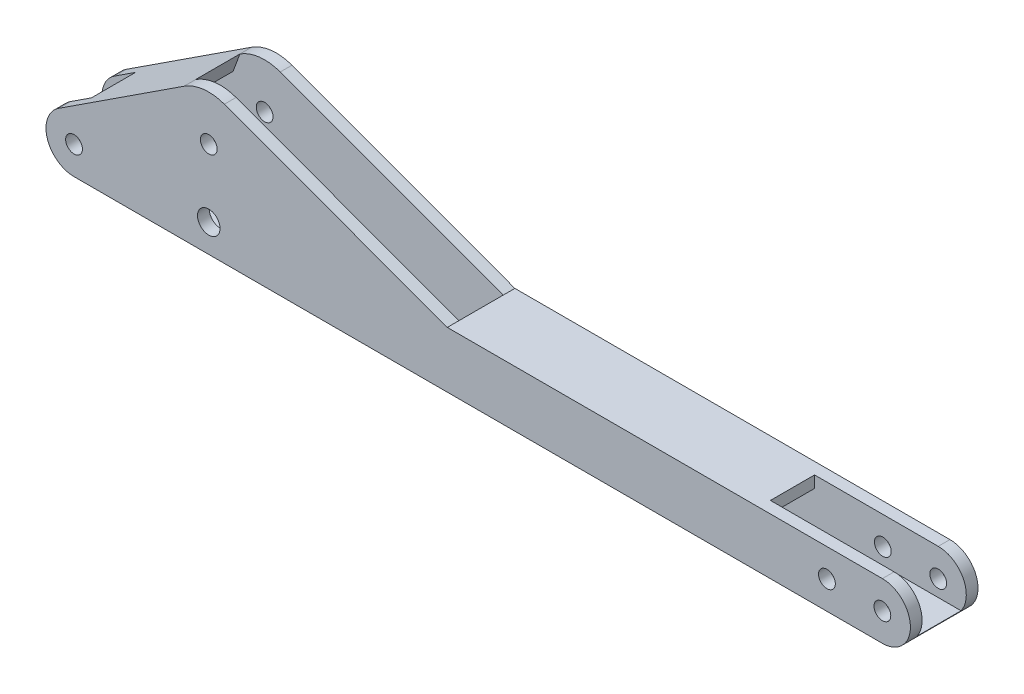
ISO-10303-21;
HEADER;
FILE_DESCRIPTION(('STEP AP214'),'2;1');
FILE_NAME('part.step','',(''),(''),'','','');
FILE_SCHEMA(('AUTOMOTIVE_DESIGN { 1 0 10303 214 1 1 1 1 }'));
ENDSEC;
DATA;
#1=APPLICATION_CONTEXT('core data for automotive mechanical design processes');
#2=APPLICATION_PROTOCOL_DEFINITION('international standard','automotive_design',2000,#1);
#3=PRODUCT_CONTEXT('',#1,'mechanical');
#4=PRODUCT('Part','Part','',(#3));
#5=PRODUCT_RELATED_PRODUCT_CATEGORY('part','',(#4));
#6=PRODUCT_DEFINITION_FORMATION('','',#4);
#7=PRODUCT_DEFINITION_CONTEXT('part definition',#1,'design');
#8=PRODUCT_DEFINITION('design','',#6,#7);
#9=PRODUCT_DEFINITION_SHAPE('','',#8);
#10=(LENGTH_UNIT() NAMED_UNIT(*) SI_UNIT(.MILLI.,.METRE.));
#11=(NAMED_UNIT(*) PLANE_ANGLE_UNIT() SI_UNIT($,.RADIAN.));
#12=(NAMED_UNIT(*) SI_UNIT($,.STERADIAN.) SOLID_ANGLE_UNIT());
#13=UNCERTAINTY_MEASURE_WITH_UNIT(LENGTH_MEASURE(1.E-05),#10,'distance_accuracy_value','');
#14=(GEOMETRIC_REPRESENTATION_CONTEXT(3) GLOBAL_UNCERTAINTY_ASSIGNED_CONTEXT((#13)) GLOBAL_UNIT_ASSIGNED_CONTEXT((#10,
#11,#12)) REPRESENTATION_CONTEXT('',''));
#15=CARTESIAN_POINT('',(0.,0.,0.));
#16=DIRECTION('',(0.,0.,1.));
#17=DIRECTION('',(1.,0.,0.));
#18=AXIS2_PLACEMENT_3D('',#15,#16,#17);
#19=CARTESIAN_POINT('',(20.4248576088717,127.,-306.));
#20=DIRECTION('',(0.,0.,1.));
#21=DIRECTION('',(1.,0.,0.));
#22=AXIS2_PLACEMENT_3D('',#19,#20,#21);
#23=CYLINDRICAL_SURFACE('',#22,127.);
#24=DIRECTION('',(0.,0.,1.));
#25=VECTOR('',#24,1.);
#26=CARTESIAN_POINT('',(20.4248576088717,0.,-306.));
#27=LINE('',#26,#25);
#28=CARTESIAN_POINT('',(20.4248576088717,0.,-306.));
#29=VERTEX_POINT('',#28);
#30=CARTESIAN_POINT('',(20.4248576088717,0.,-253.));
#31=VERTEX_POINT('',#30);
#32=EDGE_CURVE('E482',#29,#31,#27,.T.);
#33=ORIENTED_EDGE('',*,*,#32,.T.);
#34=CARTESIAN_POINT('',(20.4248576088717,127.,-253.));
#35=DIRECTION('',(0.,0.,-1.));
#36=DIRECTION('',(-1.,0.,0.));
#37=AXIS2_PLACEMENT_3D('',#34,#35,#36);
#38=CIRCLE('',#37,127.);
#39=CARTESIAN_POINT('',(-48.990064980917,233.351156654987,-253.));
#40=VERTEX_POINT('',#39);
#41=EDGE_CURVE('E269',#40,#31,#38,.F.);
#42=ORIENTED_EDGE('',*,*,#41,.F.);
#43=DIRECTION('',(0.,0.,1.));
#44=VECTOR('',#43,1.);
#45=CARTESIAN_POINT('',(-48.990064980917,233.351156654987,-306.));
#46=LINE('',#45,#44);
#47=CARTESIAN_POINT('',(-48.990064980917,233.351156654987,-306.));
#48=VERTEX_POINT('',#47);
#49=EDGE_CURVE('E454',#48,#40,#46,.T.);
#50=ORIENTED_EDGE('',*,*,#49,.F.);
#51=CARTESIAN_POINT('',(20.4248576088717,127.,-306.));
#52=DIRECTION('',(0.,0.,1.));
#53=DIRECTION('',(-1.,0.,0.));
#54=AXIS2_PLACEMENT_3D('',#51,#52,#53);
#55=CIRCLE('',#54,127.);
#56=EDGE_CURVE('E398',#48,#29,#55,.T.);
#57=ORIENTED_EDGE('',*,*,#56,.T.);
#58=EDGE_LOOP('',(#33,#42,#50,#57));
#59=FACE_BOUND('',#58,.T.);
#60=ADVANCED_FACE('F49',(#59),#23,.T.);
#61=CARTESIAN_POINT('',(20.4248576088717,0.,-306.));
#62=DIRECTION('',(0.,-1.,0.));
#63=DIRECTION('',(0.,0.,-1.));
#64=AXIS2_PLACEMENT_3D('',#61,#62,#63);
#65=PLANE('',#64);
#66=DIRECTION('',(0.,0.,1.));
#67=VECTOR('',#66,1.);
#68=CARTESIAN_POINT('',(238.666952125337,0.,-253.));
#69=LINE('',#68,#67);
#70=CARTESIAN_POINT('',(238.666952125337,0.,-253.));
#71=VERTEX_POINT('',#70);
#72=CARTESIAN_POINT('',(238.666952125337,0.,-53.));
#73=VERTEX_POINT('',#72);
#74=EDGE_CURVE('E241',#71,#73,#69,.T.);
#75=ORIENTED_EDGE('',*,*,#74,.F.);
#76=DIRECTION('',(1.,0.,0.));
#77=VECTOR('',#76,1.);
#78=CARTESIAN_POINT('',(0.,0.,-253.));
#79=LINE('',#78,#77);
#80=EDGE_CURVE('E234',#31,#71,#79,.T.);
#81=ORIENTED_EDGE('',*,*,#80,.F.);
#82=ORIENTED_EDGE('',*,*,#32,.F.);
#83=DIRECTION('',(1.,0.,0.));
#84=VECTOR('',#83,1.);
#85=CARTESIAN_POINT('',(20.4248576088717,0.,-306.));
#86=LINE('',#85,#84);
#87=CARTESIAN_POINT('',(3680.42485760887,0.,-306.));
#88=VERTEX_POINT('',#87);
#89=EDGE_CURVE('E402',#29,#88,#86,.T.);
#90=ORIENTED_EDGE('',*,*,#89,.T.);
#91=DIRECTION('',(0.,0.,1.));
#92=VECTOR('',#91,1.);
#93=CARTESIAN_POINT('',(3680.42485760887,0.,-306.));
#94=LINE('',#93,#92);
#95=CARTESIAN_POINT('',(3680.42485760887,0.,0.));
#96=VERTEX_POINT('',#95);
#97=EDGE_CURVE('E479',#88,#96,#94,.T.);
#98=ORIENTED_EDGE('',*,*,#97,.T.);
#99=DIRECTION('',(1.,0.,0.));
#100=VECTOR('',#99,1.);
#101=CARTESIAN_POINT('',(20.4248576088717,0.,0.));
#102=LINE('',#101,#100);
#103=CARTESIAN_POINT('',(20.4248576088717,0.,0.));
#104=VERTEX_POINT('',#103);
#105=EDGE_CURVE('E431',#104,#96,#102,.T.);
#106=ORIENTED_EDGE('',*,*,#105,.F.);
#107=CARTESIAN_POINT('',(20.4248576088717,0.,-53.));
#108=VERTEX_POINT('',#107);
#109=EDGE_CURVE('E427',#108,#104,#27,.T.);
#110=ORIENTED_EDGE('',*,*,#109,.F.);
#111=DIRECTION('',(1.,0.,0.));
#112=VECTOR('',#111,1.);
#113=CARTESIAN_POINT('',(0.,0.,-53.));
#114=LINE('',#113,#112);
#115=EDGE_CURVE('E231',#108,#73,#114,.T.);
#116=ORIENTED_EDGE('',*,*,#115,.T.);
#117=EDGE_LOOP('',(#75,#81,#82,#90,#98,#106,#110,#116));
#118=FACE_BOUND('',#117,.T.);
#119=ADVANCED_FACE('F558',(#118),#65,.T.);
#120=CARTESIAN_POINT('',(-48.990064980917,233.351156654987,-306.));
#121=DIRECTION('',(-0.546574193620384,0.837410682322734,0.));
#122=DIRECTION('',(-0.837410682322734,-0.546574193620384,0.));
#123=AXIS2_PLACEMENT_3D('',#120,#121,#122);
#124=PLANE('',#123);
#125=ORIENTED_EDGE('',*,*,#49,.T.);
#126=DIRECTION('',(-0.837410682322734,-0.546574193620384,0.));
#127=VECTOR('',#126,1.);
#128=CARTESIAN_POINT('',(-121.44192991147,186.062149616207,-253.));
#129=LINE('',#128,#127);
#130=CARTESIAN_POINT('',(45.9248576088717,295.301700602146,-253.));
#131=VERTEX_POINT('',#130);
#132=EDGE_CURVE('E514',#131,#40,#129,.T.);
#133=ORIENTED_EDGE('',*,*,#132,.F.);
#134=DIRECTION('',(0.,0.,1.));
#135=VECTOR('',#134,1.);
#136=CARTESIAN_POINT('',(45.9248576088717,295.301700602146,-253.));
#137=LINE('',#136,#135);
#138=CARTESIAN_POINT('',(45.9248576088717,295.301700602146,-53.));
#139=VERTEX_POINT('',#138);
#140=EDGE_CURVE('E246',#131,#139,#137,.T.);
#141=ORIENTED_EDGE('',*,*,#140,.T.);
#142=DIRECTION('',(-0.837410682322734,-0.546574193620384,0.));
#143=VECTOR('',#142,1.);
#144=CARTESIAN_POINT('',(-121.44192991147,186.062149616207,-53.));
#145=LINE('',#144,#143);
#146=CARTESIAN_POINT('',(-48.990064980917,233.351156654987,-53.));
#147=VERTEX_POINT('',#146);
#148=EDGE_CURVE('E224',#139,#147,#145,.T.);
#149=ORIENTED_EDGE('',*,*,#148,.T.);
#150=CARTESIAN_POINT('',(-48.990064980917,233.351156654987,0.));
#151=VERTEX_POINT('',#150);
#152=EDGE_CURVE('E458',#147,#151,#46,.T.);
#153=ORIENTED_EDGE('',*,*,#152,.T.);
#154=DIRECTION('',(-0.837410682322734,-0.546574193620384,0.));
#155=VECTOR('',#154,1.);
#156=CARTESIAN_POINT('',(-48.990064980917,233.351156654987,0.));
#157=LINE('',#156,#155);
#158=CARTESIAN_POINT('',(518.377147916693,603.669189876161,0.));
#159=VERTEX_POINT('',#158);
#160=EDGE_CURVE('E403',#159,#151,#157,.T.);
#161=ORIENTED_EDGE('',*,*,#160,.F.);
#162=DIRECTION('',(0.,0.,1.));
#163=VECTOR('',#162,1.);
#164=CARTESIAN_POINT('',(518.377147916693,603.669189876161,-306.));
#165=LINE('',#164,#163);
#166=CARTESIAN_POINT('',(518.377147916693,603.66918987616,-53.));
#167=VERTEX_POINT('',#166);
#168=EDGE_CURVE('E463',#167,#159,#165,.T.);
#169=ORIENTED_EDGE('',*,*,#168,.F.);
#170=DIRECTION('',(0.,0.,1.));
#171=VECTOR('',#170,1.);
#172=CARTESIAN_POINT('',(518.377147916693,603.66918987616,-306.));
#173=LINE('',#172,#171);
#174=CARTESIAN_POINT('',(518.377147916693,603.66918987616,-253.));
#175=VERTEX_POINT('',#174);
#176=EDGE_CURVE('E353',#175,#167,#173,.T.);
#177=ORIENTED_EDGE('',*,*,#176,.F.);
#178=CARTESIAN_POINT('',(518.377147916693,603.669189876161,-306.));
#179=VERTEX_POINT('',#178);
#180=EDGE_CURVE('E459',#179,#175,#165,.T.);
#181=ORIENTED_EDGE('',*,*,#180,.F.);
#182=DIRECTION('',(-0.837410682322734,-0.546574193620384,0.));
#183=VECTOR('',#182,1.);
#184=CARTESIAN_POINT('',(-48.990064980917,233.351156654987,-306.));
#185=LINE('',#184,#183);
#186=EDGE_CURVE('E423',#179,#48,#185,.T.);
#187=ORIENTED_EDGE('',*,*,#186,.T.);
#188=EDGE_LOOP('',(#125,#133,#141,#149,#153,#161,#169,#177,#181,#187));
#189=FACE_BOUND('',#188,.T.);
#190=ADVANCED_FACE('F530',(#189),#124,.T.);
#191=CARTESIAN_POINT('',(20.4248576088717,127.,-53.));
#192=DIRECTION('',(0.,0.,1.));
#193=DIRECTION('',(1.,0.,0.));
#194=AXIS2_PLACEMENT_3D('',#191,#192,#193);
#195=CIRCLE('',#194,127.);
#196=EDGE_CURVE('E262',#108,#147,#195,.F.);
#197=ORIENTED_EDGE('',*,*,#196,.F.);
#198=ORIENTED_EDGE('',*,*,#109,.T.);
#199=CARTESIAN_POINT('',(20.4248576088717,127.,0.));
#200=DIRECTION('',(0.,0.,1.));
#201=DIRECTION('',(-1.,0.,0.));
#202=AXIS2_PLACEMENT_3D('',#199,#200,#201);
#203=CIRCLE('',#202,127.);
#204=EDGE_CURVE('E394',#151,#104,#203,.T.);
#205=ORIENTED_EDGE('',*,*,#204,.F.);
#206=ORIENTED_EDGE('',*,*,#152,.F.);
#207=EDGE_LOOP('',(#197,#198,#205,#206));
#208=FACE_BOUND('',#207,.T.);
#209=ADVANCED_FACE('F51',(#208),#23,.T.);
#210=CARTESIAN_POINT('',(20.4248576088717,127.,-306.));
#211=DIRECTION('',(0.,0.,1.));
#212=DIRECTION('',(1.,0.,0.));
#213=AXIS2_PLACEMENT_3D('',#210,#211,#212);
#214=CYLINDRICAL_SURFACE('',#213,38.);
#215=CARTESIAN_POINT('',(20.4248576088717,127.,-253.));
#216=DIRECTION('',(0.,0.,-1.));
#217=DIRECTION('',(-1.,0.,0.));
#218=AXIS2_PLACEMENT_3D('',#215,#216,#217);
#219=CIRCLE('',#218,38.);
#220=CARTESIAN_POINT('',(-17.5751423911283,127.,-253.));
#221=VERTEX_POINT('',#220);
#222=EDGE_CURVE('E265',#221,#221,#219,.F.);
#223=ORIENTED_EDGE('',*,*,#222,.T.);
#224=EDGE_LOOP('',(#223));
#225=FACE_BOUND('',#224,.T.);
#226=CARTESIAN_POINT('',(20.4248576088717,127.,-306.));
#227=DIRECTION('',(0.,0.,1.));
#228=DIRECTION('',(1.,0.,0.));
#229=AXIS2_PLACEMENT_3D('',#226,#227,#228);
#230=CIRCLE('',#229,38.);
#231=CARTESIAN_POINT('',(58.4248576088717,127.,-306.));
#232=VERTEX_POINT('',#231);
#233=EDGE_CURVE('E390',#232,#232,#230,.T.);
#234=ORIENTED_EDGE('',*,*,#233,.F.);
#235=EDGE_LOOP('',(#234));
#236=FACE_BOUND('',#235,.T.);
#237=ADVANCED_FACE('F608',(#225,#236),#214,.F.);
#238=CARTESIAN_POINT('',(1412.58024503444,-557.54455502044,0.));
#239=DIRECTION('',(0.938772230359126,-0.344538386114744,0.));
#240=DIRECTION('',(0.344538386114744,0.938772230359126,0.));
#241=AXIS2_PLACEMENT_3D('',#238,#239,#240);
#242=PLANE('',#241);
#243=DIRECTION('',(0.,0.,-1.));
#244=VECTOR('',#243,1.);
#245=CARTESIAN_POINT('',(1690.97335076456,201.,0.));
#246=LINE('',#245,#244);
#247=CARTESIAN_POINT('',(1690.97335076456,201.,-53.));
#248=VERTEX_POINT('',#247);
#249=CARTESIAN_POINT('',(1690.97335076456,201.,-253.));
#250=VERTEX_POINT('',#249);
#251=EDGE_CURVE('E272',#248,#250,#246,.T.);
#252=ORIENTED_EDGE('',*,*,#251,.F.);
#253=DIRECTION('',(0.344538386114744,0.938772230359126,0.));
#254=VECTOR('',#253,1.);
#255=CARTESIAN_POINT('',(1412.58024503444,-557.54455502044,-53.));
#256=LINE('',#255,#254);
#257=CARTESIAN_POINT('',(1710.42485760887,254.,-53.));
#258=VERTEX_POINT('',#257);
#259=EDGE_CURVE('E330',#248,#258,#256,.T.);
#260=ORIENTED_EDGE('',*,*,#259,.T.);
#261=DIRECTION('',(0.,0.,-1.));
#262=VECTOR('',#261,1.);
#263=CARTESIAN_POINT('',(1710.42485760887,254.,0.));
#264=LINE('',#263,#262);
#265=CARTESIAN_POINT('',(1710.42485760887,254.,-253.));
#266=VERTEX_POINT('',#265);
#267=EDGE_CURVE('E320',#258,#266,#264,.T.);
#268=ORIENTED_EDGE('',*,*,#267,.T.);
#269=DIRECTION('',(0.344538386114744,0.938772230359126,0.));
#270=VECTOR('',#269,1.);
#271=CARTESIAN_POINT('',(1412.58024503444,-557.54455502044,-253.));
#272=LINE('',#271,#270);
#273=EDGE_CURVE('E325',#250,#266,#272,.T.);
#274=ORIENTED_EDGE('',*,*,#273,.F.);
#275=EDGE_LOOP('',(#252,#260,#268,#274));
#276=FACE_BOUND('',#275,.T.);
#277=ADVANCED_FACE('F582',(#276),#242,.F.);
#278=CARTESIAN_POINT('',(248.938508643888,-130.476909742534,0.));
#279=DIRECTION('',(-0.938772230359126,0.344538386114744,0.));
#280=DIRECTION('',(-0.344538386114744,-0.938772230359126,0.));
#281=AXIS2_PLACEMENT_3D('',#278,#279,#280);
#282=PLANE('',#281);
#283=DIRECTION('',(0.344538386114744,0.938772230359126,0.));
#284=VECTOR('',#283,1.);
#285=CARTESIAN_POINT('',(248.938508643888,-130.476909742534,-53.));
#286=LINE('',#285,#284);
#287=CARTESIAN_POINT('',(487.83205037018,520.442209934578,-53.));
#288=VERTEX_POINT('',#287);
#289=EDGE_CURVE('E333',#288,#167,#286,.T.);
#290=ORIENTED_EDGE('',*,*,#289,.F.);
#291=DIRECTION('',(0.,0.,-1.));
#292=VECTOR('',#291,1.);
#293=CARTESIAN_POINT('',(487.83205037018,520.442209934578,0.));
#294=LINE('',#293,#292);
#295=CARTESIAN_POINT('',(487.83205037018,520.442209934578,-253.));
#296=VERTEX_POINT('',#295);
#297=EDGE_CURVE('E207',#288,#296,#294,.T.);
#298=ORIENTED_EDGE('',*,*,#297,.T.);
#299=DIRECTION('',(0.344538386114744,0.938772230359126,0.));
#300=VECTOR('',#299,1.);
#301=CARTESIAN_POINT('',(248.938508643888,-130.476909742534,-253.));
#302=LINE('',#301,#300);
#303=EDGE_CURVE('E324',#296,#175,#302,.T.);
#304=ORIENTED_EDGE('',*,*,#303,.T.);
#305=ORIENTED_EDGE('',*,*,#176,.T.);
#306=EDGE_LOOP('',(#290,#298,#304,#305));
#307=FACE_BOUND('',#306,.T.);
#308=ADVANCED_FACE('F645',(#307),#282,.F.);
#309=CARTESIAN_POINT('',(3120.42485760887,53.,0.));
#310=DIRECTION('',(-1.,0.,0.));
#311=DIRECTION('',(0.,0.,1.));
#312=AXIS2_PLACEMENT_3D('',#309,#310,#311);
#313=PLANE('',#312);
#314=DIRECTION('',(0.,0.,-1.));
#315=VECTOR('',#314,1.);
#316=CARTESIAN_POINT('',(3120.42485760887,201.,0.));
#317=LINE('',#316,#315);
#318=CARTESIAN_POINT('',(3120.42485760887,201.,-53.));
#319=VERTEX_POINT('',#318);
#320=CARTESIAN_POINT('',(3120.42485760887,201.,-253.));
#321=VERTEX_POINT('',#320);
#322=EDGE_CURVE('E245',#319,#321,#317,.T.);
#323=ORIENTED_EDGE('',*,*,#322,.T.);
#324=DIRECTION('',(0.,1.,0.));
#325=VECTOR('',#324,1.);
#326=CARTESIAN_POINT('',(3120.42485760887,53.,-253.));
#327=LINE('',#326,#325);
#328=CARTESIAN_POINT('',(3120.42485760887,254.,-253.));
#329=VERTEX_POINT('',#328);
#330=EDGE_CURVE('E294',#321,#329,#327,.T.);
#331=ORIENTED_EDGE('',*,*,#330,.T.);
#332=DIRECTION('',(0.,0.,1.));
#333=VECTOR('',#332,1.);
#334=CARTESIAN_POINT('',(3120.42485760887,254.,0.));
#335=LINE('',#334,#333);
#336=CARTESIAN_POINT('',(3120.42485760887,254.,-53.));
#337=VERTEX_POINT('',#336);
#338=EDGE_CURVE('E275',#329,#337,#335,.T.);
#339=ORIENTED_EDGE('',*,*,#338,.T.);
#340=DIRECTION('',(0.,1.,0.));
#341=VECTOR('',#340,1.);
#342=CARTESIAN_POINT('',(3120.42485760887,53.,-53.));
#343=LINE('',#342,#341);
#344=EDGE_CURVE('E283',#319,#337,#343,.T.);
#345=ORIENTED_EDGE('',*,*,#344,.F.);
#346=EDGE_LOOP('',(#323,#331,#339,#345));
#347=FACE_BOUND('',#346,.T.);
#348=ADVANCED_FACE('F576',(#347),#313,.F.);
#349=CARTESIAN_POINT('',(1710.42485760887,254.,-306.));
#350=DIRECTION('',(0.,1.,0.));
#351=DIRECTION('',(0.,0.,1.));
#352=AXIS2_PLACEMENT_3D('',#349,#350,#351);
#353=PLANE('',#352);
#354=ORIENTED_EDGE('',*,*,#338,.F.);
#355=DIRECTION('',(1.,0.,0.));
#356=VECTOR('',#355,1.);
#357=CARTESIAN_POINT('',(0.,254.,-253.));
#358=LINE('',#357,#356);
#359=CARTESIAN_POINT('',(3680.42485760887,254.,-253.));
#360=VERTEX_POINT('',#359);
#361=EDGE_CURVE('E279',#329,#360,#358,.T.);
#362=ORIENTED_EDGE('',*,*,#361,.T.);
#363=DIRECTION('',(0.,0.,1.));
#364=VECTOR('',#363,1.);
#365=CARTESIAN_POINT('',(3680.42485760887,254.,-306.));
#366=LINE('',#365,#364);
#367=CARTESIAN_POINT('',(3680.42485760887,254.,-306.));
#368=VERTEX_POINT('',#367);
#369=EDGE_CURVE('E474',#368,#360,#366,.T.);
#370=ORIENTED_EDGE('',*,*,#369,.F.);
#371=DIRECTION('',(-1.,0.,0.));
#372=VECTOR('',#371,1.);
#373=CARTESIAN_POINT('',(1710.42485760887,254.,-306.));
#374=LINE('',#373,#372);
#375=CARTESIAN_POINT('',(1710.42485760887,254.,-306.));
#376=VERTEX_POINT('',#375);
#377=EDGE_CURVE('E411',#368,#376,#374,.T.);
#378=ORIENTED_EDGE('',*,*,#377,.T.);
#379=DIRECTION('',(0.,0.,1.));
#380=VECTOR('',#379,1.);
#381=CARTESIAN_POINT('',(1710.42485760887,254.,-306.));
#382=LINE('',#381,#380);
#383=EDGE_CURVE('E469',#376,#266,#382,.T.);
#384=ORIENTED_EDGE('',*,*,#383,.T.);
#385=ORIENTED_EDGE('',*,*,#267,.F.);
#386=CARTESIAN_POINT('',(1710.42485760887,254.,0.));
#387=VERTEX_POINT('',#386);
#388=EDGE_CURVE('E473',#258,#387,#382,.T.);
#389=ORIENTED_EDGE('',*,*,#388,.T.);
#390=DIRECTION('',(-1.,0.,0.));
#391=VECTOR('',#390,1.);
#392=CARTESIAN_POINT('',(1710.42485760887,254.,0.));
#393=LINE('',#392,#391);
#394=CARTESIAN_POINT('',(3680.42485760887,254.,0.));
#395=VERTEX_POINT('',#394);
#396=EDGE_CURVE('E439',#395,#387,#393,.T.);
#397=ORIENTED_EDGE('',*,*,#396,.F.);
#398=CARTESIAN_POINT('',(3680.42485760887,254.,-53.));
#399=VERTEX_POINT('',#398);
#400=EDGE_CURVE('E478',#399,#395,#366,.T.);
#401=ORIENTED_EDGE('',*,*,#400,.F.);
#402=DIRECTION('',(1.,0.,0.));
#403=VECTOR('',#402,1.);
#404=CARTESIAN_POINT('',(0.,254.,-53.));
#405=LINE('',#404,#403);
#406=EDGE_CURVE('E287',#337,#399,#405,.T.);
#407=ORIENTED_EDGE('',*,*,#406,.F.);
#408=EDGE_LOOP('',(#354,#362,#370,#378,#384,#385,#389,#397,#401,#407));
#409=FACE_BOUND('',#408,.T.);
#410=ADVANCED_FACE('F568',(#409),#353,.T.);
#411=CARTESIAN_POINT('',(3680.42485760887,127.,-306.));
#412=DIRECTION('',(0.,0.,1.));
#413=DIRECTION('',(1.,0.,0.));
#414=AXIS2_PLACEMENT_3D('',#411,#412,#413);
#415=CYLINDRICAL_SURFACE('',#414,127.);
#416=CARTESIAN_POINT('',(3680.42485760887,127.,-53.));
#417=DIRECTION('',(0.,0.,1.));
#418=DIRECTION('',(1.,0.,0.));
#419=AXIS2_PLACEMENT_3D('',#416,#417,#418);
#420=CIRCLE('',#419,127.);
#421=CARTESIAN_POINT('',(3783.63822883567,53.,-53.));
#422=VERTEX_POINT('',#421);
#423=EDGE_CURVE('E304',#399,#422,#420,.F.);
#424=ORIENTED_EDGE('',*,*,#423,.F.);
#425=ORIENTED_EDGE('',*,*,#400,.T.);
#426=CARTESIAN_POINT('',(3680.42485760887,127.,0.));
#427=DIRECTION('',(0.,0.,1.));
#428=DIRECTION('',(-1.,0.,0.));
#429=AXIS2_PLACEMENT_3D('',#426,#427,#428);
#430=CIRCLE('',#429,127.);
#431=EDGE_CURVE('E435',#96,#395,#430,.T.);
#432=ORIENTED_EDGE('',*,*,#431,.F.);
#433=ORIENTED_EDGE('',*,*,#97,.F.);
#434=CARTESIAN_POINT('',(3680.42485760887,127.,-306.));
#435=DIRECTION('',(0.,0.,1.));
#436=DIRECTION('',(-1.,0.,0.));
#437=AXIS2_PLACEMENT_3D('',#434,#435,#436);
#438=CIRCLE('',#437,127.);
#439=EDGE_CURVE('E407',#88,#368,#438,.T.);
#440=ORIENTED_EDGE('',*,*,#439,.T.);
#441=ORIENTED_EDGE('',*,*,#369,.T.);
#442=CARTESIAN_POINT('',(3680.42485760887,127.,-253.));
#443=DIRECTION('',(0.,0.,1.));
#444=DIRECTION('',(1.,0.,0.));
#445=AXIS2_PLACEMENT_3D('',#442,#443,#444);
#446=CIRCLE('',#445,127.);
#447=CARTESIAN_POINT('',(3783.63822883567,53.,-253.));
#448=VERTEX_POINT('',#447);
#449=EDGE_CURVE('E312',#360,#448,#446,.F.);
#450=ORIENTED_EDGE('',*,*,#449,.T.);
#451=DIRECTION('',(0.,0.,1.));
#452=VECTOR('',#451,1.);
#453=CARTESIAN_POINT('',(3783.63822883567,53.,-306.));
#454=LINE('',#453,#452);
#455=EDGE_CURVE('E58',#448,#422,#454,.T.);
#456=ORIENTED_EDGE('',*,*,#455,.T.);
#457=EDGE_LOOP('',(#424,#425,#432,#433,#440,#441,#450,#456));
#458=FACE_BOUND('',#457,.T.);
#459=ADVANCED_FACE('F500',(#458),#415,.T.);
#460=CARTESIAN_POINT('',(3680.42485760887,127.,-306.));
#461=DIRECTION('',(0.,0.,1.));
#462=DIRECTION('',(1.,0.,0.));
#463=AXIS2_PLACEMENT_3D('',#460,#461,#462);
#464=CYLINDRICAL_SURFACE('',#463,37.9999999999998);
#465=CARTESIAN_POINT('',(3680.42485760887,127.,-306.));
#466=DIRECTION('',(0.,0.,1.));
#467=DIRECTION('',(1.,0.,0.));
#468=AXIS2_PLACEMENT_3D('',#465,#466,#467);
#469=CIRCLE('',#468,37.9999999999998);
#470=CARTESIAN_POINT('',(3718.42485760887,127.,-306.));
#471=VERTEX_POINT('',#470);
#472=EDGE_CURVE('E366',#471,#471,#469,.T.);
#473=ORIENTED_EDGE('',*,*,#472,.F.);
#474=EDGE_LOOP('',(#473));
#475=FACE_BOUND('',#474,.T.);
#476=CARTESIAN_POINT('',(3680.42485760887,127.,-253.));
#477=DIRECTION('',(0.,0.,1.));
#478=DIRECTION('',(1.,0.,0.));
#479=AXIS2_PLACEMENT_3D('',#476,#477,#478);
#480=CIRCLE('',#479,37.9999999999998);
#481=CARTESIAN_POINT('',(3718.42485760887,127.,-253.));
#482=VERTEX_POINT('',#481);
#483=EDGE_CURVE('E308',#482,#482,#480,.F.);
#484=ORIENTED_EDGE('',*,*,#483,.F.);
#485=EDGE_LOOP('',(#484));
#486=FACE_BOUND('',#485,.T.);
#487=ADVANCED_FACE('F638',(#475,#486),#464,.F.);
#488=CARTESIAN_POINT('',(3429.42485760887,127.,-306.));
#489=DIRECTION('',(0.,0.,1.));
#490=DIRECTION('',(1.,0.,0.));
#491=AXIS2_PLACEMENT_3D('',#488,#489,#490);
#492=CYLINDRICAL_SURFACE('',#491,37.9999999999998);
#493=CARTESIAN_POINT('',(3429.42485760887,127.,-306.));
#494=DIRECTION('',(0.,0.,1.));
#495=DIRECTION('',(1.,0.,0.));
#496=AXIS2_PLACEMENT_3D('',#493,#494,#495);
#497=CIRCLE('',#496,37.9999999999998);
#498=CARTESIAN_POINT('',(3467.42485760887,127.,-306.));
#499=VERTEX_POINT('',#498);
#500=EDGE_CURVE('E358',#499,#499,#497,.T.);
#501=ORIENTED_EDGE('',*,*,#500,.F.);
#502=EDGE_LOOP('',(#501));
#503=FACE_BOUND('',#502,.T.);
#504=CARTESIAN_POINT('',(3429.42485760887,127.,-253.));
#505=DIRECTION('',(0.,0.,1.));
#506=DIRECTION('',(1.,0.,0.));
#507=AXIS2_PLACEMENT_3D('',#504,#505,#506);
#508=CIRCLE('',#507,37.9999999999998);
#509=CARTESIAN_POINT('',(3467.42485760887,127.,-253.));
#510=VERTEX_POINT('',#509);
#511=EDGE_CURVE('E307',#510,#510,#508,.F.);
#512=ORIENTED_EDGE('',*,*,#511,.F.);
#513=EDGE_LOOP('',(#512));
#514=FACE_BOUND('',#513,.T.);
#515=ADVANCED_FACE('F642',(#503,#514),#492,.F.);
#516=CARTESIAN_POINT('',(630.424857608872,432.,-306.));
#517=DIRECTION('',(0.,0.,1.));
#518=DIRECTION('',(1.,0.,0.));
#519=AXIS2_PLACEMENT_3D('',#516,#517,#518);
#520=CYLINDRICAL_SURFACE('',#519,205.);
#521=ORIENTED_EDGE('',*,*,#180,.T.);
#522=CARTESIAN_POINT('',(630.424857608872,432.,-253.));
#523=DIRECTION('',(0.,0.,1.));
#524=DIRECTION('',(1.,0.,0.));
#525=AXIS2_PLACEMENT_3D('',#522,#523,#524);
#526=CIRCLE('',#525,205.);
#527=CARTESIAN_POINT('',(701.055226762394,624.448307223621,-253.));
#528=VERTEX_POINT('',#527);
#529=EDGE_CURVE('E350',#175,#528,#526,.F.);
#530=ORIENTED_EDGE('',*,*,#529,.T.);
#531=DIRECTION('',(0.,0.,1.));
#532=VECTOR('',#531,1.);
#533=CARTESIAN_POINT('',(701.055226762394,624.448307223621,-306.));
#534=LINE('',#533,#532);
#535=CARTESIAN_POINT('',(701.055226762394,624.448307223621,-306.));
#536=VERTEX_POINT('',#535);
#537=EDGE_CURVE('E464',#536,#528,#534,.T.);
#538=ORIENTED_EDGE('',*,*,#537,.F.);
#539=CARTESIAN_POINT('',(630.424857608872,432.,-306.));
#540=DIRECTION('',(0.,0.,1.));
#541=DIRECTION('',(-1.,0.,0.));
#542=AXIS2_PLACEMENT_3D('',#539,#540,#541);
#543=CIRCLE('',#542,205.);
#544=EDGE_CURVE('E419',#536,#179,#543,.T.);
#545=ORIENTED_EDGE('',*,*,#544,.T.);
#546=EDGE_LOOP('',(#521,#530,#538,#545));
#547=FACE_BOUND('',#546,.T.);
#548=ADVANCED_FACE('F546',(#547),#520,.T.);
#549=CARTESIAN_POINT('',(701.055226762394,624.448307223621,-306.));
#550=DIRECTION('',(0.344538386114745,0.938772230359126,0.));
#551=DIRECTION('',(-0.938772230359126,0.344538386114745,0.));
#552=AXIS2_PLACEMENT_3D('',#549,#550,#551);
#553=PLANE('',#552);
#554=ORIENTED_EDGE('',*,*,#537,.T.);
#555=DIRECTION('',(0.938772230359126,-0.344538386114745,0.));
#556=VECTOR('',#555,1.);
#557=CARTESIAN_POINT('',(285.193429171742,777.073563867448,-253.));
#558=LINE('',#557,#556);
#559=EDGE_CURVE('E315',#528,#266,#558,.T.);
#560=ORIENTED_EDGE('',*,*,#559,.T.);
#561=ORIENTED_EDGE('',*,*,#383,.F.);
#562=DIRECTION('',(-0.938772230359126,0.344538386114745,0.));
#563=VECTOR('',#562,1.);
#564=CARTESIAN_POINT('',(701.055226762394,624.448307223621,-306.));
#565=LINE('',#564,#563);
#566=EDGE_CURVE('E415',#376,#536,#565,.T.);
#567=ORIENTED_EDGE('',*,*,#566,.T.);
#568=EDGE_LOOP('',(#554,#560,#561,#567));
#569=FACE_BOUND('',#568,.T.);
#570=ADVANCED_FACE('F587',(#569),#553,.T.);
#571=CARTESIAN_POINT('',(630.424857608872,127.,-306.));
#572=DIRECTION('',(0.,0.,1.));
#573=DIRECTION('',(1.,0.,0.));
#574=AXIS2_PLACEMENT_3D('',#571,#572,#573);
#575=CYLINDRICAL_SURFACE('',#574,51.0000000000001);
#576=CARTESIAN_POINT('',(630.424857608872,127.,-306.));
#577=DIRECTION('',(0.,0.,1.));
#578=DIRECTION('',(1.,0.,0.));
#579=AXIS2_PLACEMENT_3D('',#576,#577,#578);
#580=CIRCLE('',#579,51.0000000000001);
#581=CARTESIAN_POINT('',(681.424857608872,127.,-306.));
#582=VERTEX_POINT('',#581);
#583=EDGE_CURVE('E382',#582,#582,#580,.T.);
#584=ORIENTED_EDGE('',*,*,#583,.F.);
#585=EDGE_LOOP('',(#584));
#586=FACE_BOUND('',#585,.T.);
#587=CARTESIAN_POINT('',(630.424857608872,127.,-253.));
#588=DIRECTION('',(0.,0.,1.));
#589=DIRECTION('',(1.,0.,0.));
#590=AXIS2_PLACEMENT_3D('',#587,#588,#589);
#591=CIRCLE('',#590,51.0000000000001);
#592=CARTESIAN_POINT('',(681.424857608872,127.,-253.));
#593=VERTEX_POINT('',#592);
#594=EDGE_CURVE('E346',#593,#593,#591,.F.);
#595=ORIENTED_EDGE('',*,*,#594,.F.);
#596=EDGE_LOOP('',(#595));
#597=FACE_BOUND('',#596,.T.);
#598=ADVANCED_FACE('F602',(#586,#597),#575,.F.);
#599=CARTESIAN_POINT('',(630.424857608872,432.,-306.));
#600=DIRECTION('',(0.,0.,1.));
#601=DIRECTION('',(1.,0.,0.));
#602=AXIS2_PLACEMENT_3D('',#599,#600,#601);
#603=CYLINDRICAL_SURFACE('',#602,38.);
#604=CARTESIAN_POINT('',(630.424857608872,432.,-306.));
#605=DIRECTION('',(0.,0.,1.));
#606=DIRECTION('',(1.,0.,0.));
#607=AXIS2_PLACEMENT_3D('',#604,#605,#606);
#608=CIRCLE('',#607,38.);
#609=CARTESIAN_POINT('',(668.424857608872,432.,-306.));
#610=VERTEX_POINT('',#609);
#611=EDGE_CURVE('E374',#610,#610,#608,.T.);
#612=ORIENTED_EDGE('',*,*,#611,.F.);
#613=EDGE_LOOP('',(#612));
#614=FACE_BOUND('',#613,.T.);
#615=CARTESIAN_POINT('',(630.424857608872,432.,-253.));
#616=DIRECTION('',(0.,0.,1.));
#617=DIRECTION('',(1.,0.,0.));
#618=AXIS2_PLACEMENT_3D('',#615,#616,#617);
#619=CIRCLE('',#618,38.);
#620=CARTESIAN_POINT('',(668.424857608872,432.,-253.));
#621=VERTEX_POINT('',#620);
#622=EDGE_CURVE('E345',#621,#621,#619,.F.);
#623=ORIENTED_EDGE('',*,*,#622,.F.);
#624=EDGE_LOOP('',(#623));
#625=FACE_BOUND('',#624,.T.);
#626=ADVANCED_FACE('F598',(#614,#625),#603,.F.);
#627=CARTESIAN_POINT('',(630.424857608872,432.,-53.));
#628=DIRECTION('',(0.,0.,1.));
#629=DIRECTION('',(1.,0.,0.));
#630=AXIS2_PLACEMENT_3D('',#627,#628,#629);
#631=CIRCLE('',#630,205.);
#632=CARTESIAN_POINT('',(701.055226762394,624.448307223621,-53.));
#633=VERTEX_POINT('',#632);
#634=EDGE_CURVE('E342',#167,#633,#631,.F.);
#635=ORIENTED_EDGE('',*,*,#634,.F.);
#636=ORIENTED_EDGE('',*,*,#168,.T.);
#637=CARTESIAN_POINT('',(630.424857608872,432.,0.));
#638=DIRECTION('',(0.,0.,1.));
#639=DIRECTION('',(-1.,0.,0.));
#640=AXIS2_PLACEMENT_3D('',#637,#638,#639);
#641=CIRCLE('',#640,205.);
#642=CARTESIAN_POINT('',(701.055226762394,624.448307223621,0.));
#643=VERTEX_POINT('',#642);
#644=EDGE_CURVE('E447',#643,#159,#641,.T.);
#645=ORIENTED_EDGE('',*,*,#644,.F.);
#646=EDGE_CURVE('E468',#633,#643,#534,.T.);
#647=ORIENTED_EDGE('',*,*,#646,.F.);
#648=EDGE_LOOP('',(#635,#636,#645,#647));
#649=FACE_BOUND('',#648,.T.);
#650=ADVANCED_FACE('F542',(#649),#520,.T.);
#651=DIRECTION('',(0.938772230359126,-0.344538386114745,0.));
#652=VECTOR('',#651,1.);
#653=CARTESIAN_POINT('',(285.193429171742,777.073563867448,-53.));
#654=LINE('',#653,#652);
#655=EDGE_CURVE('E73',#633,#258,#654,.T.);
#656=ORIENTED_EDGE('',*,*,#655,.F.);
#657=ORIENTED_EDGE('',*,*,#646,.T.);
#658=DIRECTION('',(-0.938772230359126,0.344538386114745,0.));
#659=VECTOR('',#658,1.);
#660=CARTESIAN_POINT('',(701.055226762394,624.448307223621,0.));
#661=LINE('',#660,#659);
#662=EDGE_CURVE('E443',#387,#643,#661,.T.);
#663=ORIENTED_EDGE('',*,*,#662,.F.);
#664=ORIENTED_EDGE('',*,*,#388,.F.);
#665=EDGE_LOOP('',(#656,#657,#663,#664));
#666=FACE_BOUND('',#665,.T.);
#667=ADVANCED_FACE('F589',(#666),#553,.T.);
#668=CARTESIAN_POINT('',(20.4248576088717,127.,-306.));
#669=DIRECTION('',(0.,0.,-1.));
#670=DIRECTION('',(-1.,0.,0.));
#671=AXIS2_PLACEMENT_3D('',#668,#669,#670);
#672=PLANE('',#671);
#673=ORIENTED_EDGE('',*,*,#500,.T.);
#674=EDGE_LOOP('',(#673));
#675=FACE_BOUND('',#674,.T.);
#676=ORIENTED_EDGE('',*,*,#472,.T.);
#677=EDGE_LOOP('',(#676));
#678=FACE_BOUND('',#677,.T.);
#679=ORIENTED_EDGE('',*,*,#611,.T.);
#680=EDGE_LOOP('',(#679));
#681=FACE_BOUND('',#680,.T.);
#682=ORIENTED_EDGE('',*,*,#583,.T.);
#683=EDGE_LOOP('',(#682));
#684=FACE_BOUND('',#683,.T.);
#685=ORIENTED_EDGE('',*,*,#233,.T.);
#686=EDGE_LOOP('',(#685));
#687=FACE_BOUND('',#686,.T.);
#688=ORIENTED_EDGE('',*,*,#56,.F.);
#689=ORIENTED_EDGE('',*,*,#186,.F.);
#690=ORIENTED_EDGE('',*,*,#544,.F.);
#691=ORIENTED_EDGE('',*,*,#566,.F.);
#692=ORIENTED_EDGE('',*,*,#377,.F.);
#693=ORIENTED_EDGE('',*,*,#439,.F.);
#694=ORIENTED_EDGE('',*,*,#89,.F.);
#695=EDGE_LOOP('',(#688,#689,#690,#691,#692,#693,#694));
#696=FACE_BOUND('',#695,.T.);
#697=ADVANCED_FACE('F554',(#675,#678,#681,#684,#687,#696),#672,.T.);
#698=CARTESIAN_POINT('',(20.4248576088717,127.,0.));
#699=DIRECTION('',(0.,0.,-1.));
#700=DIRECTION('',(-1.,0.,0.));
#701=AXIS2_PLACEMENT_3D('',#698,#699,#700);
#702=PLANE('',#701);
#703=CARTESIAN_POINT('',(3429.42485760887,127.,0.));
#704=DIRECTION('',(0.,0.,1.));
#705=DIRECTION('',(1.,0.,0.));
#706=AXIS2_PLACEMENT_3D('',#703,#704,#705);
#707=CIRCLE('',#706,37.9999999999998);
#708=CARTESIAN_POINT('',(3467.42485760887,127.,0.));
#709=VERTEX_POINT('',#708);
#710=EDGE_CURVE('E357',#709,#709,#707,.T.);
#711=ORIENTED_EDGE('',*,*,#710,.F.);
#712=EDGE_LOOP('',(#711));
#713=FACE_BOUND('',#712,.T.);
#714=CARTESIAN_POINT('',(3680.42485760887,127.,0.));
#715=DIRECTION('',(0.,0.,1.));
#716=DIRECTION('',(1.,0.,0.));
#717=AXIS2_PLACEMENT_3D('',#714,#715,#716);
#718=CIRCLE('',#717,37.9999999999998);
#719=CARTESIAN_POINT('',(3718.42485760887,127.,0.));
#720=VERTEX_POINT('',#719);
#721=EDGE_CURVE('E362',#720,#720,#718,.T.);
#722=ORIENTED_EDGE('',*,*,#721,.F.);
#723=EDGE_LOOP('',(#722));
#724=FACE_BOUND('',#723,.T.);
#725=CARTESIAN_POINT('',(630.424857608872,432.,0.));
#726=DIRECTION('',(0.,0.,1.));
#727=DIRECTION('',(1.,0.,0.));
#728=AXIS2_PLACEMENT_3D('',#725,#726,#727);
#729=CIRCLE('',#728,38.);
#730=CARTESIAN_POINT('',(668.424857608872,432.,0.));
#731=VERTEX_POINT('',#730);
#732=EDGE_CURVE('E370',#731,#731,#729,.T.);
#733=ORIENTED_EDGE('',*,*,#732,.F.);
#734=EDGE_LOOP('',(#733));
#735=FACE_BOUND('',#734,.T.);
#736=CARTESIAN_POINT('',(630.424857608872,127.,0.));
#737=DIRECTION('',(0.,0.,1.));
#738=DIRECTION('',(1.,0.,0.));
#739=AXIS2_PLACEMENT_3D('',#736,#737,#738);
#740=CIRCLE('',#739,51.0000000000001);
#741=CARTESIAN_POINT('',(681.424857608872,127.,0.));
#742=VERTEX_POINT('',#741);
#743=EDGE_CURVE('E378',#742,#742,#740,.T.);
#744=ORIENTED_EDGE('',*,*,#743,.F.);
#745=EDGE_LOOP('',(#744));
#746=FACE_BOUND('',#745,.T.);
#747=CARTESIAN_POINT('',(20.4248576088717,127.,0.));
#748=DIRECTION('',(0.,0.,1.));
#749=DIRECTION('',(1.,0.,0.));
#750=AXIS2_PLACEMENT_3D('',#747,#748,#749);
#751=CIRCLE('',#750,38.);
#752=CARTESIAN_POINT('',(58.4248576088717,127.,0.));
#753=VERTEX_POINT('',#752);
#754=EDGE_CURVE('E386',#753,#753,#751,.T.);
#755=ORIENTED_EDGE('',*,*,#754,.F.);
#756=EDGE_LOOP('',(#755));
#757=FACE_BOUND('',#756,.T.);
#758=ORIENTED_EDGE('',*,*,#204,.T.);
#759=ORIENTED_EDGE('',*,*,#105,.T.);
#760=ORIENTED_EDGE('',*,*,#431,.T.);
#761=ORIENTED_EDGE('',*,*,#396,.T.);
#762=ORIENTED_EDGE('',*,*,#662,.T.);
#763=ORIENTED_EDGE('',*,*,#644,.T.);
#764=ORIENTED_EDGE('',*,*,#160,.T.);
#765=EDGE_LOOP('',(#758,#759,#760,#761,#762,#763,#764));
#766=FACE_BOUND('',#765,.T.);
#767=ADVANCED_FACE('F536',(#713,#724,#735,#746,#757,#766),#702,.F.);
#768=CARTESIAN_POINT('',(20.4248576088717,127.,-53.));
#769=DIRECTION('',(0.,0.,1.));
#770=DIRECTION('',(1.,0.,0.));
#771=AXIS2_PLACEMENT_3D('',#768,#769,#770);
#772=CIRCLE('',#771,38.);
#773=CARTESIAN_POINT('',(58.4248576088717,127.,-53.));
#774=VERTEX_POINT('',#773);
#775=EDGE_CURVE('E256',#774,#774,#772,.F.);
#776=ORIENTED_EDGE('',*,*,#775,.T.);
#777=EDGE_LOOP('',(#776));
#778=FACE_BOUND('',#777,.T.);
#779=ORIENTED_EDGE('',*,*,#754,.T.);
#780=EDGE_LOOP('',(#779));
#781=FACE_BOUND('',#780,.T.);
#782=ADVANCED_FACE('F615',(#778,#781),#214,.F.);
#783=CARTESIAN_POINT('',(630.424857608872,127.,-53.));
#784=DIRECTION('',(0.,0.,1.));
#785=DIRECTION('',(1.,0.,0.));
#786=AXIS2_PLACEMENT_3D('',#783,#784,#785);
#787=CIRCLE('',#786,51.0000000000001);
#788=CARTESIAN_POINT('',(681.424857608872,127.,-53.));
#789=VERTEX_POINT('',#788);
#790=EDGE_CURVE('E338',#789,#789,#787,.F.);
#791=ORIENTED_EDGE('',*,*,#790,.T.);
#792=EDGE_LOOP('',(#791));
#793=FACE_BOUND('',#792,.T.);
#794=ORIENTED_EDGE('',*,*,#743,.T.);
#795=EDGE_LOOP('',(#794));
#796=FACE_BOUND('',#795,.T.);
#797=ADVANCED_FACE('F624',(#793,#796),#575,.F.);
#798=CARTESIAN_POINT('',(630.424857608872,432.,-53.));
#799=DIRECTION('',(0.,0.,1.));
#800=DIRECTION('',(1.,0.,0.));
#801=AXIS2_PLACEMENT_3D('',#798,#799,#800);
#802=CIRCLE('',#801,38.);
#803=CARTESIAN_POINT('',(668.424857608872,432.,-53.));
#804=VERTEX_POINT('',#803);
#805=EDGE_CURVE('E329',#804,#804,#802,.F.);
#806=ORIENTED_EDGE('',*,*,#805,.T.);
#807=EDGE_LOOP('',(#806));
#808=FACE_BOUND('',#807,.T.);
#809=ORIENTED_EDGE('',*,*,#732,.T.);
#810=EDGE_LOOP('',(#809));
#811=FACE_BOUND('',#810,.T.);
#812=ADVANCED_FACE('F628',(#808,#811),#603,.F.);
#813=CARTESIAN_POINT('',(3680.42485760887,127.,-53.));
#814=DIRECTION('',(0.,0.,1.));
#815=DIRECTION('',(1.,0.,0.));
#816=AXIS2_PLACEMENT_3D('',#813,#814,#815);
#817=CIRCLE('',#816,37.9999999999998);
#818=CARTESIAN_POINT('',(3718.42485760887,127.,-53.));
#819=VERTEX_POINT('',#818);
#820=EDGE_CURVE('E300',#819,#819,#817,.F.);
#821=ORIENTED_EDGE('',*,*,#820,.T.);
#822=EDGE_LOOP('',(#821));
#823=FACE_BOUND('',#822,.T.);
#824=ORIENTED_EDGE('',*,*,#721,.T.);
#825=EDGE_LOOP('',(#824));
#826=FACE_BOUND('',#825,.T.);
#827=ADVANCED_FACE('F632',(#823,#826),#464,.F.);
#828=CARTESIAN_POINT('',(3429.42485760887,127.,-53.));
#829=DIRECTION('',(0.,0.,1.));
#830=DIRECTION('',(1.,0.,0.));
#831=AXIS2_PLACEMENT_3D('',#828,#829,#830);
#832=CIRCLE('',#831,37.9999999999998);
#833=CARTESIAN_POINT('',(3467.42485760887,127.,-53.));
#834=VERTEX_POINT('',#833);
#835=EDGE_CURVE('E297',#834,#834,#832,.F.);
#836=ORIENTED_EDGE('',*,*,#835,.T.);
#837=EDGE_LOOP('',(#836));
#838=FACE_BOUND('',#837,.T.);
#839=ORIENTED_EDGE('',*,*,#710,.T.);
#840=EDGE_LOOP('',(#839));
#841=FACE_BOUND('',#840,.T.);
#842=ADVANCED_FACE('F636',(#838,#841),#492,.F.);
#843=CARTESIAN_POINT('',(-12.6511834026917,-34.4709911529915,-253.));
#844=DIRECTION('',(0.,0.,1.));
#845=DIRECTION('',(1.,0.,0.));
#846=AXIS2_PLACEMENT_3D('',#843,#844,#845);
#847=PLANE('',#846);
#848=DIRECTION('',(0.546574193620384,-0.837410682322734,0.));
#849=VECTOR('',#848,1.);
#850=CARTESIAN_POINT('',(167.366787520341,109.239550985939,-253.));
#851=LINE('',#850,#849);
#852=CARTESIAN_POINT('',(204.074090016711,53.,-253.));
#853=VERTEX_POINT('',#852);
#854=EDGE_CURVE('E240',#853,#71,#851,.T.);
#855=ORIENTED_EDGE('',*,*,#854,.F.);
#856=DIRECTION('',(1.,0.,0.));
#857=VECTOR('',#856,1.);
#858=CARTESIAN_POINT('',(0.,53.,-253.));
#859=LINE('',#858,#857);
#860=EDGE_CURVE('E278',#853,#448,#859,.T.);
#861=ORIENTED_EDGE('',*,*,#860,.T.);
#862=ORIENTED_EDGE('',*,*,#449,.F.);
#863=ORIENTED_EDGE('',*,*,#361,.F.);
#864=ORIENTED_EDGE('',*,*,#330,.F.);
#865=DIRECTION('',(1.,0.,0.));
#866=VECTOR('',#865,1.);
#867=CARTESIAN_POINT('',(-106.575142391129,201.,-253.));
#868=LINE('',#867,#866);
#869=EDGE_CURVE('E253',#250,#321,#868,.T.);
#870=ORIENTED_EDGE('',*,*,#869,.F.);
#871=ORIENTED_EDGE('',*,*,#273,.T.);
#872=ORIENTED_EDGE('',*,*,#559,.F.);
#873=ORIENTED_EDGE('',*,*,#529,.F.);
#874=ORIENTED_EDGE('',*,*,#303,.F.);
#875=DIRECTION('',(-0.837410682322734,-0.546574193620384,0.));
#876=VECTOR('',#875,1.);
#877=CARTESIAN_POINT('',(2869.06790901296,2074.66416665428,-253.));
#878=LINE('',#877,#876);
#879=CARTESIAN_POINT('',(74.893289870752,250.918934439041,-253.));
#880=VERTEX_POINT('',#879);
#881=EDGE_CURVE('E211',#296,#880,#878,.T.);
#882=ORIENTED_EDGE('',*,*,#881,.T.);
#883=EDGE_CURVE('E218',#131,#880,#851,.T.);
#884=ORIENTED_EDGE('',*,*,#883,.F.);
#885=ORIENTED_EDGE('',*,*,#132,.T.);
#886=ORIENTED_EDGE('',*,*,#41,.T.);
#887=ORIENTED_EDGE('',*,*,#80,.T.);
#888=EDGE_LOOP('',(#855,#861,#862,#863,#864,#870,#871,#872,#873,#874,#882,#884,#885,#886,#887));
#889=FACE_BOUND('',#888,.T.);
#890=ORIENTED_EDGE('',*,*,#222,.F.);
#891=EDGE_LOOP('',(#890));
#892=FACE_BOUND('',#891,.T.);
#893=ORIENTED_EDGE('',*,*,#594,.T.);
#894=EDGE_LOOP('',(#893));
#895=FACE_BOUND('',#894,.T.);
#896=ORIENTED_EDGE('',*,*,#483,.T.);
#897=EDGE_LOOP('',(#896));
#898=FACE_BOUND('',#897,.T.);
#899=ORIENTED_EDGE('',*,*,#511,.T.);
#900=EDGE_LOOP('',(#899));
#901=FACE_BOUND('',#900,.T.);
#902=ORIENTED_EDGE('',*,*,#622,.T.);
#903=EDGE_LOOP('',(#902));
#904=FACE_BOUND('',#903,.T.);
#905=ADVANCED_FACE('F504',(#889,#892,#895,#898,#901,#904),#847,.T.);
#906=CARTESIAN_POINT('',(-12.6511834026917,-34.4709911529915,-53.));
#907=DIRECTION('',(0.,0.,1.));
#908=DIRECTION('',(1.,0.,0.));
#909=AXIS2_PLACEMENT_3D('',#906,#907,#908);
#910=PLANE('',#909);
#911=DIRECTION('',(1.,0.,0.));
#912=VECTOR('',#911,1.);
#913=CARTESIAN_POINT('',(0.,53.,-53.));
#914=LINE('',#913,#912);
#915=CARTESIAN_POINT('',(204.074090016711,53.,-53.));
#916=VERTEX_POINT('',#915);
#917=EDGE_CURVE('E65',#916,#422,#914,.T.);
#918=ORIENTED_EDGE('',*,*,#917,.F.);
#919=DIRECTION('',(0.546574193620384,-0.837410682322734,0.));
#920=VECTOR('',#919,1.);
#921=CARTESIAN_POINT('',(167.366787520341,109.239550985939,-53.));
#922=LINE('',#921,#920);
#923=EDGE_CURVE('E227',#916,#73,#922,.T.);
#924=ORIENTED_EDGE('',*,*,#923,.T.);
#925=ORIENTED_EDGE('',*,*,#115,.F.);
#926=ORIENTED_EDGE('',*,*,#196,.T.);
#927=ORIENTED_EDGE('',*,*,#148,.F.);
#928=CARTESIAN_POINT('',(74.893289870752,250.918934439041,-53.));
#929=VERTEX_POINT('',#928);
#930=EDGE_CURVE('E215',#139,#929,#922,.T.);
#931=ORIENTED_EDGE('',*,*,#930,.T.);
#932=DIRECTION('',(-0.837410682322734,-0.546574193620384,0.));
#933=VECTOR('',#932,1.);
#934=CARTESIAN_POINT('',(2869.06790901296,2074.66416665428,-53.));
#935=LINE('',#934,#933);
#936=EDGE_CURVE('E201',#288,#929,#935,.T.);
#937=ORIENTED_EDGE('',*,*,#936,.F.);
#938=ORIENTED_EDGE('',*,*,#289,.T.);
#939=ORIENTED_EDGE('',*,*,#634,.T.);
#940=ORIENTED_EDGE('',*,*,#655,.T.);
#941=ORIENTED_EDGE('',*,*,#259,.F.);
#942=DIRECTION('',(1.,0.,0.));
#943=VECTOR('',#942,1.);
#944=CARTESIAN_POINT('',(-106.575142391129,201.,-53.));
#945=LINE('',#944,#943);
#946=EDGE_CURVE('E252',#248,#319,#945,.T.);
#947=ORIENTED_EDGE('',*,*,#946,.T.);
#948=ORIENTED_EDGE('',*,*,#344,.T.);
#949=ORIENTED_EDGE('',*,*,#406,.T.);
#950=ORIENTED_EDGE('',*,*,#423,.T.);
#951=EDGE_LOOP('',(#918,#924,#925,#926,#927,#931,#937,#938,#939,#940,#941,#947,#948,#949,#950));
#952=FACE_BOUND('',#951,.T.);
#953=ORIENTED_EDGE('',*,*,#775,.F.);
#954=EDGE_LOOP('',(#953));
#955=FACE_BOUND('',#954,.T.);
#956=ORIENTED_EDGE('',*,*,#790,.F.);
#957=EDGE_LOOP('',(#956));
#958=FACE_BOUND('',#957,.T.);
#959=ORIENTED_EDGE('',*,*,#820,.F.);
#960=EDGE_LOOP('',(#959));
#961=FACE_BOUND('',#960,.T.);
#962=ORIENTED_EDGE('',*,*,#835,.F.);
#963=EDGE_LOOP('',(#962));
#964=FACE_BOUND('',#963,.T.);
#965=ORIENTED_EDGE('',*,*,#805,.F.);
#966=EDGE_LOOP('',(#965));
#967=FACE_BOUND('',#966,.T.);
#968=ADVANCED_FACE('F221',(#952,#955,#958,#961,#964,#967),#910,.F.);
#969=CARTESIAN_POINT('',(0.,53.,0.));
#970=DIRECTION('',(0.,1.,0.));
#971=DIRECTION('',(0.,0.,1.));
#972=AXIS2_PLACEMENT_3D('',#969,#970,#971);
#973=PLANE('',#972);
#974=ORIENTED_EDGE('',*,*,#860,.F.);
#975=DIRECTION('',(0.,0.,-1.));
#976=VECTOR('',#975,1.);
#977=CARTESIAN_POINT('',(204.074090016711,53.,0.));
#978=LINE('',#977,#976);
#979=EDGE_CURVE('E12',#916,#853,#978,.T.);
#980=ORIENTED_EDGE('',*,*,#979,.F.);
#981=ORIENTED_EDGE('',*,*,#917,.T.);
#982=ORIENTED_EDGE('',*,*,#455,.F.);
#983=EDGE_LOOP('',(#974,#980,#981,#982));
#984=FACE_BOUND('',#983,.T.);
#985=ADVANCED_FACE('F501',(#984),#973,.T.);
#986=CARTESIAN_POINT('',(-106.575142391129,201.,0.));
#987=DIRECTION('',(0.,-1.,0.));
#988=DIRECTION('',(0.,0.,-1.));
#989=AXIS2_PLACEMENT_3D('',#986,#987,#988);
#990=PLANE('',#989);
#991=ORIENTED_EDGE('',*,*,#251,.T.);
#992=ORIENTED_EDGE('',*,*,#869,.T.);
#993=ORIENTED_EDGE('',*,*,#322,.F.);
#994=ORIENTED_EDGE('',*,*,#946,.F.);
#995=EDGE_LOOP('',(#991,#992,#993,#994));
#996=FACE_BOUND('',#995,.T.);
#997=ADVANCED_FACE('F579',(#996),#990,.T.);
#998=CARTESIAN_POINT('',(167.366787520341,109.239550985939,-253.));
#999=DIRECTION('',(-0.837410682322734,-0.546574193620384,0.));
#1000=DIRECTION('',(0.546574193620384,-0.837410682322734,0.));
#1001=AXIS2_PLACEMENT_3D('',#998,#999,#1000);
#1002=PLANE('',#1001);
#1003=ORIENTED_EDGE('',*,*,#979,.T.);
#1004=ORIENTED_EDGE('',*,*,#854,.T.);
#1005=ORIENTED_EDGE('',*,*,#74,.T.);
#1006=ORIENTED_EDGE('',*,*,#923,.F.);
#1007=EDGE_LOOP('',(#1003,#1004,#1005,#1006));
#1008=FACE_BOUND('',#1007,.T.);
#1009=ADVANCED_FACE('F561',(#1008),#1002,.T.);
#1010=DIRECTION('',(0.,0.,-1.));
#1011=VECTOR('',#1010,1.);
#1012=CARTESIAN_POINT('',(74.893289870752,250.918934439041,-253.));
#1013=LINE('',#1012,#1011);
#1014=EDGE_CURVE('E204',#929,#880,#1013,.T.);
#1015=ORIENTED_EDGE('',*,*,#1014,.F.);
#1016=ORIENTED_EDGE('',*,*,#930,.F.);
#1017=ORIENTED_EDGE('',*,*,#140,.F.);
#1018=ORIENTED_EDGE('',*,*,#883,.T.);
#1019=EDGE_LOOP('',(#1015,#1016,#1017,#1018));
#1020=FACE_BOUND('',#1019,.T.);
#1021=ADVANCED_FACE('F214',(#1020),#1002,.T.);
#1022=CARTESIAN_POINT('',(2869.06790901296,2074.66416665428,-253.));
#1023=DIRECTION('',(-0.546574193620384,0.837410682322734,0.));
#1024=DIRECTION('',(-0.837410682322734,-0.546574193620384,0.));
#1025=AXIS2_PLACEMENT_3D('',#1022,#1023,#1024);
#1026=PLANE('',#1025);
#1027=ORIENTED_EDGE('',*,*,#936,.T.);
#1028=ORIENTED_EDGE('',*,*,#1014,.T.);
#1029=ORIENTED_EDGE('',*,*,#881,.F.);
#1030=ORIENTED_EDGE('',*,*,#297,.F.);
#1031=EDGE_LOOP('',(#1027,#1028,#1029,#1030));
#1032=FACE_BOUND('',#1031,.T.);
#1033=ADVANCED_FACE('F203',(#1032),#1026,.F.);
#1034=CLOSED_SHELL('',(#60,#119,#190,#209,#237,#277,#308,#348,#410,#459,#487,#515,#548,#570,
#598,#626,#650,#667,#697,#767,#782,#797,#812,#827,#842,#905,#968,#985,#997,#1009,#1021,#1033));
#1035=MANIFOLD_SOLID_BREP('B2',#1034);
#1036=ADVANCED_BREP_SHAPE_REPRESENTATION('',(#18,#1035),#14);
#1037=SHAPE_DEFINITION_REPRESENTATION(#9,#1036);
ENDSEC;
END-ISO-10303-21;
